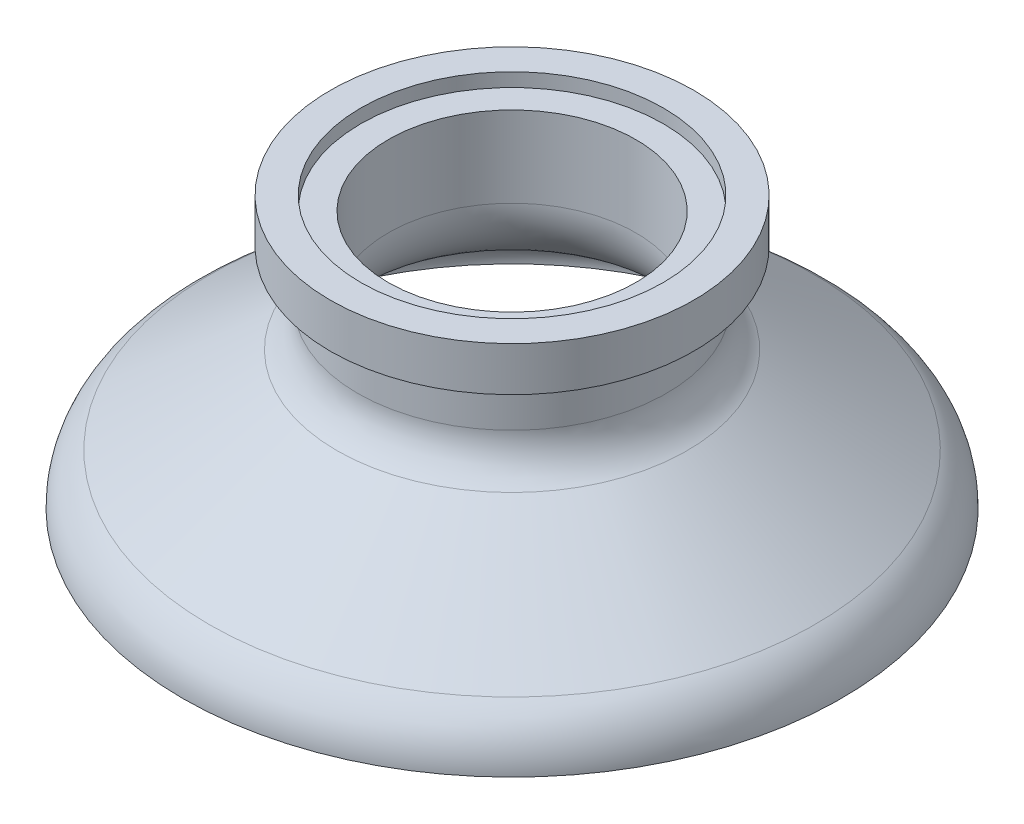
ISO-10303-21;
HEADER;
FILE_DESCRIPTION(('STEP AP214'),'2;1');
FILE_NAME('part.step','',(''),(''),'','','');
FILE_SCHEMA(('AUTOMOTIVE_DESIGN { 1 0 10303 214 1 1 1 1 }'));
ENDSEC;
DATA;
#1=APPLICATION_CONTEXT('core data for automotive mechanical design processes');
#2=APPLICATION_PROTOCOL_DEFINITION('international standard','automotive_design',2000,#1);
#3=PRODUCT_CONTEXT('',#1,'mechanical');
#4=PRODUCT('Part','Part','',(#3));
#5=PRODUCT_RELATED_PRODUCT_CATEGORY('part','',(#4));
#6=PRODUCT_DEFINITION_FORMATION('','',#4);
#7=PRODUCT_DEFINITION_CONTEXT('part definition',#1,'design');
#8=PRODUCT_DEFINITION('design','',#6,#7);
#9=PRODUCT_DEFINITION_SHAPE('','',#8);
#10=(LENGTH_UNIT() NAMED_UNIT(*) SI_UNIT(.MILLI.,.METRE.));
#11=(NAMED_UNIT(*) PLANE_ANGLE_UNIT() SI_UNIT($,.RADIAN.));
#12=(NAMED_UNIT(*) SI_UNIT($,.STERADIAN.) SOLID_ANGLE_UNIT());
#13=UNCERTAINTY_MEASURE_WITH_UNIT(LENGTH_MEASURE(1.E-05),#10,'distance_accuracy_value','');
#14=(GEOMETRIC_REPRESENTATION_CONTEXT(3) GLOBAL_UNCERTAINTY_ASSIGNED_CONTEXT((#13)) GLOBAL_UNIT_ASSIGNED_CONTEXT((#10,
#11,#12)) REPRESENTATION_CONTEXT('',''));
#15=CARTESIAN_POINT('',(0.,0.,0.));
#16=DIRECTION('',(0.,0.,1.));
#17=DIRECTION('',(1.,0.,0.));
#18=AXIS2_PLACEMENT_3D('',#15,#16,#17);
#19=CARTESIAN_POINT('',(0.,135.537090780889,0.));
#20=DIRECTION('',(0.,1.,0.));
#21=DIRECTION('',(0.,0.,1.));
#22=AXIS2_PLACEMENT_3D('',#19,#20,#21);
#23=TOROIDAL_SURFACE('',#22,55.8506106293866,12.7);
#24=CARTESIAN_POINT('',(0.,146.041145392436,0.));
#25=DIRECTION('',(0.,1.,0.));
#26=DIRECTION('',(0.,0.,1.));
#27=AXIS2_PLACEMENT_3D('',#24,#25,#26);
#28=CIRCLE('',#27,62.9888762953326);
#29=CARTESIAN_POINT('',(0.,146.041145392436,62.9888762953326));
#30=VERTEX_POINT('',#29);
#31=EDGE_CURVE('E10',#30,#30,#28,.T.);
#32=ORIENTED_EDGE('',*,*,#31,.F.);
#33=EDGE_LOOP('',(#32));
#34=FACE_BOUND('',#33,.T.);
#35=CARTESIAN_POINT('',(0.,135.537090780889,0.));
#36=DIRECTION('',(0.,1.,0.));
#37=DIRECTION('',(0.,0.,1.));
#38=AXIS2_PLACEMENT_3D('',#35,#36,#37);
#39=CIRCLE('',#38,68.5506106293866);
#40=CARTESIAN_POINT('',(0.,135.537090780889,68.5506106293866));
#41=VERTEX_POINT('',#40);
#42=EDGE_CURVE('E67',#41,#41,#39,.T.);
#43=ORIENTED_EDGE('',*,*,#42,.T.);
#44=EDGE_LOOP('',(#43));
#45=FACE_BOUND('',#44,.T.);
#46=ADVANCED_FACE('F35',(#34,#45),#23,.T.);
#47=CARTESIAN_POINT('',(0.,146.041145392436,0.));
#48=DIRECTION('',(0.,-1.,0.));
#49=DIRECTION('',(0.,0.,-1.));
#50=AXIS2_PLACEMENT_3D('',#47,#48,#49);
#51=CONICAL_SURFACE('',#50,62.9888762953326,0.973912118745665);
#52=CARTESIAN_POINT('',(0.,164.092378592853,0.));
#53=DIRECTION('',(0.,1.,0.));
#54=DIRECTION('',(0.,0.,1.));
#55=AXIS2_PLACEMENT_3D('',#52,#53,#54);
#56=CIRCLE('',#55,36.4262421463226);
#57=CARTESIAN_POINT('',(0.,164.092378592853,36.4262421463226));
#58=VERTEX_POINT('',#57);
#59=EDGE_CURVE('E41',#58,#58,#56,.T.);
#60=ORIENTED_EDGE('',*,*,#59,.F.);
#61=EDGE_LOOP('',(#60));
#62=FACE_BOUND('',#61,.T.);
#63=ORIENTED_EDGE('',*,*,#31,.T.);
#64=EDGE_LOOP('',(#63));
#65=FACE_BOUND('',#64,.T.);
#66=ADVANCED_FACE('F106',(#62,#65),#51,.T.);
#67=CARTESIAN_POINT('',(0.,172.244930881121,0.));
#68=DIRECTION('',(0.,1.,0.));
#69=DIRECTION('',(0.,0.,1.));
#70=AXIS2_PLACEMENT_3D('',#67,#68,#69);
#71=TOROIDAL_SURFACE('',#70,41.9664917205388,9.85689982487104);
#72=CARTESIAN_POINT('',(0.,172.244930881121,0.));
#73=DIRECTION('',(0.,1.,0.));
#74=DIRECTION('',(0.,0.,1.));
#75=AXIS2_PLACEMENT_3D('',#72,#73,#74);
#76=CIRCLE('',#75,32.1095918956678);
#77=CARTESIAN_POINT('',(0.,172.244930881121,32.1095918956678));
#78=VERTEX_POINT('',#77);
#79=EDGE_CURVE('E45',#78,#78,#76,.T.);
#80=ORIENTED_EDGE('',*,*,#79,.F.);
#81=EDGE_LOOP('',(#80));
#82=FACE_BOUND('',#81,.T.);
#83=ORIENTED_EDGE('',*,*,#59,.T.);
#84=EDGE_LOOP('',(#83));
#85=FACE_BOUND('',#84,.T.);
#86=ADVANCED_FACE('F111',(#82,#85),#71,.F.);
#87=CARTESIAN_POINT('',(0.,191.88999199796,0.));
#88=DIRECTION('',(0.,1.,0.));
#89=DIRECTION('',(0.,0.,1.));
#90=AXIS2_PLACEMENT_3D('',#87,#88,#89);
#91=CYLINDRICAL_SURFACE('',#90,32.1095918956678);
#92=CARTESIAN_POINT('',(0.,182.693006016334,0.));
#93=DIRECTION('',(0.,1.,0.));
#94=DIRECTION('',(0.,0.,1.));
#95=AXIS2_PLACEMENT_3D('',#92,#93,#94);
#96=CIRCLE('',#95,32.1095918956678);
#97=CARTESIAN_POINT('',(0.,182.693006016334,32.1095918956678));
#98=VERTEX_POINT('',#97);
#99=EDGE_CURVE('E49',#98,#98,#96,.T.);
#100=ORIENTED_EDGE('',*,*,#99,.F.);
#101=EDGE_LOOP('',(#100));
#102=FACE_BOUND('',#101,.T.);
#103=ORIENTED_EDGE('',*,*,#79,.T.);
#104=EDGE_LOOP('',(#103));
#105=FACE_BOUND('',#104,.T.);
#106=ADVANCED_FACE('F116',(#102,#105),#91,.T.);
#107=CARTESIAN_POINT('',(32.1095918956678,182.693006016334,0.));
#108=DIRECTION('',(0.,1.,0.));
#109=DIRECTION('',(0.,0.,1.));
#110=AXIS2_PLACEMENT_3D('',#107,#108,#109);
#111=PLANE('',#110);
#112=CARTESIAN_POINT('',(0.,182.693006016334,0.));
#113=DIRECTION('',(0.,1.,0.));
#114=DIRECTION('',(0.,0.,1.));
#115=AXIS2_PLACEMENT_3D('',#112,#113,#114);
#116=CIRCLE('',#115,37.8125387824389);
#117=CARTESIAN_POINT('',(0.,182.693006016334,37.8125387824389));
#118=VERTEX_POINT('',#117);
#119=EDGE_CURVE('E54',#118,#118,#116,.T.);
#120=ORIENTED_EDGE('',*,*,#119,.F.);
#121=EDGE_LOOP('',(#120));
#122=FACE_BOUND('',#121,.T.);
#123=ORIENTED_EDGE('',*,*,#99,.T.);
#124=EDGE_LOOP('',(#123));
#125=FACE_BOUND('',#124,.T.);
#126=ADVANCED_FACE('F122',(#122,#125),#111,.F.);
#127=CARTESIAN_POINT('',(0.,191.88999199796,0.));
#128=DIRECTION('',(0.,1.,0.));
#129=DIRECTION('',(0.,0.,1.));
#130=AXIS2_PLACEMENT_3D('',#127,#128,#129);
#131=CYLINDRICAL_SURFACE('',#130,37.8125387824389);
#132=CARTESIAN_POINT('',(0.,191.88999199796,0.));
#133=DIRECTION('',(0.,1.,0.));
#134=DIRECTION('',(0.,0.,1.));
#135=AXIS2_PLACEMENT_3D('',#132,#133,#134);
#136=CIRCLE('',#135,37.8125387824389);
#137=CARTESIAN_POINT('',(0.,191.88999199796,37.8125387824389));
#138=VERTEX_POINT('',#137);
#139=EDGE_CURVE('E57',#138,#138,#136,.T.);
#140=ORIENTED_EDGE('',*,*,#139,.F.);
#141=EDGE_LOOP('',(#140));
#142=FACE_BOUND('',#141,.T.);
#143=ORIENTED_EDGE('',*,*,#119,.T.);
#144=EDGE_LOOP('',(#143));
#145=FACE_BOUND('',#144,.T.);
#146=ADVANCED_FACE('F126',(#142,#145),#131,.T.);
#147=CARTESIAN_POINT('',(37.8125387824389,191.88999199796,0.));
#148=DIRECTION('',(0.,-1.,0.));
#149=DIRECTION('',(0.,0.,-1.));
#150=AXIS2_PLACEMENT_3D('',#147,#148,#149);
#151=PLANE('',#150);
#152=CARTESIAN_POINT('',(0.,191.88999199796,0.));
#153=DIRECTION('',(0.,-1.,0.));
#154=DIRECTION('',(0.,0.,-1.));
#155=AXIS2_PLACEMENT_3D('',#152,#153,#154);
#156=CIRCLE('',#155,31.4625387824389);
#157=CARTESIAN_POINT('',(0.,191.88999199796,-31.4625387824389));
#158=VERTEX_POINT('',#157);
#159=EDGE_CURVE('E61',#158,#158,#156,.F.);
#160=ORIENTED_EDGE('',*,*,#159,.F.);
#161=EDGE_LOOP('',(#160));
#162=FACE_BOUND('',#161,.T.);
#163=ORIENTED_EDGE('',*,*,#139,.T.);
#164=EDGE_LOOP('',(#163));
#165=FACE_BOUND('',#164,.T.);
#166=ADVANCED_FACE('F90',(#162,#165),#151,.F.);
#167=CARTESIAN_POINT('',(0.,135.537090780889,0.));
#168=DIRECTION('',(0.,-1.,0.));
#169=DIRECTION('',(0.,0.,-1.));
#170=AXIS2_PLACEMENT_3D('',#167,#168,#169);
#171=PLANE('',#170);
#172=ORIENTED_EDGE('',*,*,#42,.F.);
#173=EDGE_LOOP('',(#172));
#174=FACE_BOUND('',#173,.T.);
#175=CARTESIAN_POINT('',(0.,135.537090780889,0.));
#176=DIRECTION('',(0.,-1.,0.));
#177=DIRECTION('',(0.,0.,-1.));
#178=AXIS2_PLACEMENT_3D('',#175,#176,#177);
#179=CIRCLE('',#178,62.2006106293866);
#180=CARTESIAN_POINT('',(0.,135.537090780889,-62.2006106293866));
#181=VERTEX_POINT('',#180);
#182=EDGE_CURVE('E60',#181,#181,#179,.F.);
#183=ORIENTED_EDGE('',*,*,#182,.T.);
#184=EDGE_LOOP('',(#183));
#185=FACE_BOUND('',#184,.T.);
#186=ADVANCED_FACE('F86',(#174,#185),#171,.T.);
#187=CARTESIAN_POINT('',(0.,135.537090780889,0.));
#188=DIRECTION('',(0.,1.,0.));
#189=DIRECTION('',(0.,0.,1.));
#190=AXIS2_PLACEMENT_3D('',#187,#188,#189);
#191=TOROIDAL_SURFACE('',#190,55.8506106293866,6.34999999999998);
#192=CARTESIAN_POINT('',(0.,140.789118086662,0.));
#193=DIRECTION('',(0.,-1.,0.));
#194=DIRECTION('',(0.,0.,-1.));
#195=AXIS2_PLACEMENT_3D('',#192,#193,#194);
#196=CIRCLE('',#195,59.4197434623596);
#197=CARTESIAN_POINT('',(0.,140.789118086662,-59.4197434623596));
#198=VERTEX_POINT('',#197);
#199=EDGE_CURVE('E79',#198,#198,#196,.F.);
#200=ORIENTED_EDGE('',*,*,#199,.T.);
#201=EDGE_LOOP('',(#200));
#202=FACE_BOUND('',#201,.T.);
#203=ORIENTED_EDGE('',*,*,#182,.F.);
#204=EDGE_LOOP('',(#203));
#205=FACE_BOUND('',#204,.T.);
#206=ADVANCED_FACE('F89',(#202,#205),#191,.F.);
#207=CARTESIAN_POINT('',(0.,140.789118086662,0.));
#208=DIRECTION('',(0.,-1.,0.));
#209=DIRECTION('',(0.,0.,-1.));
#210=AXIS2_PLACEMENT_3D('',#207,#208,#209);
#211=CONICAL_SURFACE('',#210,59.4197434623596,0.973912118745665);
#212=CARTESIAN_POINT('',(0.,158.84035128708,0.));
#213=DIRECTION('',(0.,1.,0.));
#214=DIRECTION('',(0.,0.,1.));
#215=AXIS2_PLACEMENT_3D('',#212,#213,#214);
#216=CIRCLE('',#215,32.8571093133496);
#217=CARTESIAN_POINT('',(0.,158.84035128708,32.8571093133496));
#218=VERTEX_POINT('',#217);
#219=EDGE_CURVE('E76',#218,#218,#216,.T.);
#220=ORIENTED_EDGE('',*,*,#219,.T.);
#221=EDGE_LOOP('',(#220));
#222=FACE_BOUND('',#221,.T.);
#223=ORIENTED_EDGE('',*,*,#199,.F.);
#224=EDGE_LOOP('',(#223));
#225=FACE_BOUND('',#224,.T.);
#226=ADVANCED_FACE('F95',(#222,#225),#211,.F.);
#227=CARTESIAN_POINT('',(0.,172.244930881121,0.));
#228=DIRECTION('',(0.,1.,0.));
#229=DIRECTION('',(0.,0.,1.));
#230=AXIS2_PLACEMENT_3D('',#227,#228,#229);
#231=TOROIDAL_SURFACE('',#230,41.9664917205388,16.206899824871);
#232=CARTESIAN_POINT('',(0.,172.244930881121,0.));
#233=DIRECTION('',(0.,1.,0.));
#234=DIRECTION('',(0.,0.,1.));
#235=AXIS2_PLACEMENT_3D('',#232,#233,#234);
#236=CIRCLE('',#235,25.7595918956678);
#237=CARTESIAN_POINT('',(0.,172.244930881121,25.7595918956678));
#238=VERTEX_POINT('',#237);
#239=EDGE_CURVE('E73',#238,#238,#236,.T.);
#240=ORIENTED_EDGE('',*,*,#239,.T.);
#241=EDGE_LOOP('',(#240));
#242=FACE_BOUND('',#241,.T.);
#243=ORIENTED_EDGE('',*,*,#219,.F.);
#244=EDGE_LOOP('',(#243));
#245=FACE_BOUND('',#244,.T.);
#246=ADVANCED_FACE('F102',(#242,#245),#231,.T.);
#247=CARTESIAN_POINT('',(0.,191.88999199796,0.));
#248=DIRECTION('',(0.,1.,0.));
#249=DIRECTION('',(0.,0.,1.));
#250=AXIS2_PLACEMENT_3D('',#247,#248,#249);
#251=CYLINDRICAL_SURFACE('',#250,25.7595918956678);
#252=CARTESIAN_POINT('',(0.,189.043006016334,0.));
#253=DIRECTION('',(0.,1.,0.));
#254=DIRECTION('',(0.,0.,1.));
#255=AXIS2_PLACEMENT_3D('',#252,#253,#254);
#256=CIRCLE('',#255,25.7595918956678);
#257=CARTESIAN_POINT('',(0.,189.043006016334,25.7595918956678));
#258=VERTEX_POINT('',#257);
#259=EDGE_CURVE('E70',#258,#258,#256,.T.);
#260=ORIENTED_EDGE('',*,*,#259,.T.);
#261=EDGE_LOOP('',(#260));
#262=FACE_BOUND('',#261,.T.);
#263=ORIENTED_EDGE('',*,*,#239,.F.);
#264=EDGE_LOOP('',(#263));
#265=FACE_BOUND('',#264,.T.);
#266=ADVANCED_FACE('F141',(#262,#265),#251,.F.);
#267=CARTESIAN_POINT('',(32.1095918956678,189.043006016334,0.));
#268=DIRECTION('',(0.,1.,0.));
#269=DIRECTION('',(0.,0.,1.));
#270=AXIS2_PLACEMENT_3D('',#267,#268,#269);
#271=PLANE('',#270);
#272=CARTESIAN_POINT('',(0.,189.043006016334,0.));
#273=DIRECTION('',(0.,1.,0.));
#274=DIRECTION('',(0.,0.,1.));
#275=AXIS2_PLACEMENT_3D('',#272,#273,#274);
#276=CIRCLE('',#275,31.4625387824389);
#277=CARTESIAN_POINT('',(0.,189.043006016334,31.4625387824389));
#278=VERTEX_POINT('',#277);
#279=EDGE_CURVE('E64',#278,#278,#276,.T.);
#280=ORIENTED_EDGE('',*,*,#279,.T.);
#281=EDGE_LOOP('',(#280));
#282=FACE_BOUND('',#281,.T.);
#283=ORIENTED_EDGE('',*,*,#259,.F.);
#284=EDGE_LOOP('',(#283));
#285=FACE_BOUND('',#284,.T.);
#286=ADVANCED_FACE('F137',(#282,#285),#271,.T.);
#287=CARTESIAN_POINT('',(0.,191.88999199796,0.));
#288=DIRECTION('',(0.,1.,0.));
#289=DIRECTION('',(0.,0.,1.));
#290=AXIS2_PLACEMENT_3D('',#287,#288,#289);
#291=CYLINDRICAL_SURFACE('',#290,31.4625387824389);
#292=ORIENTED_EDGE('',*,*,#159,.T.);
#293=EDGE_LOOP('',(#292));
#294=FACE_BOUND('',#293,.T.);
#295=ORIENTED_EDGE('',*,*,#279,.F.);
#296=EDGE_LOOP('',(#295));
#297=FACE_BOUND('',#296,.T.);
#298=ADVANCED_FACE('F134',(#294,#297),#291,.F.);
#299=CLOSED_SHELL('',(#46,#66,#86,#106,#126,#146,#166,#186,#206,#226,#246,#266,#286,#298));
#300=MANIFOLD_SOLID_BREP('B2',#299);
#301=ADVANCED_BREP_SHAPE_REPRESENTATION('',(#18,#300),#14);
#302=SHAPE_DEFINITION_REPRESENTATION(#9,#301);
ENDSEC;
END-ISO-10303-21;
